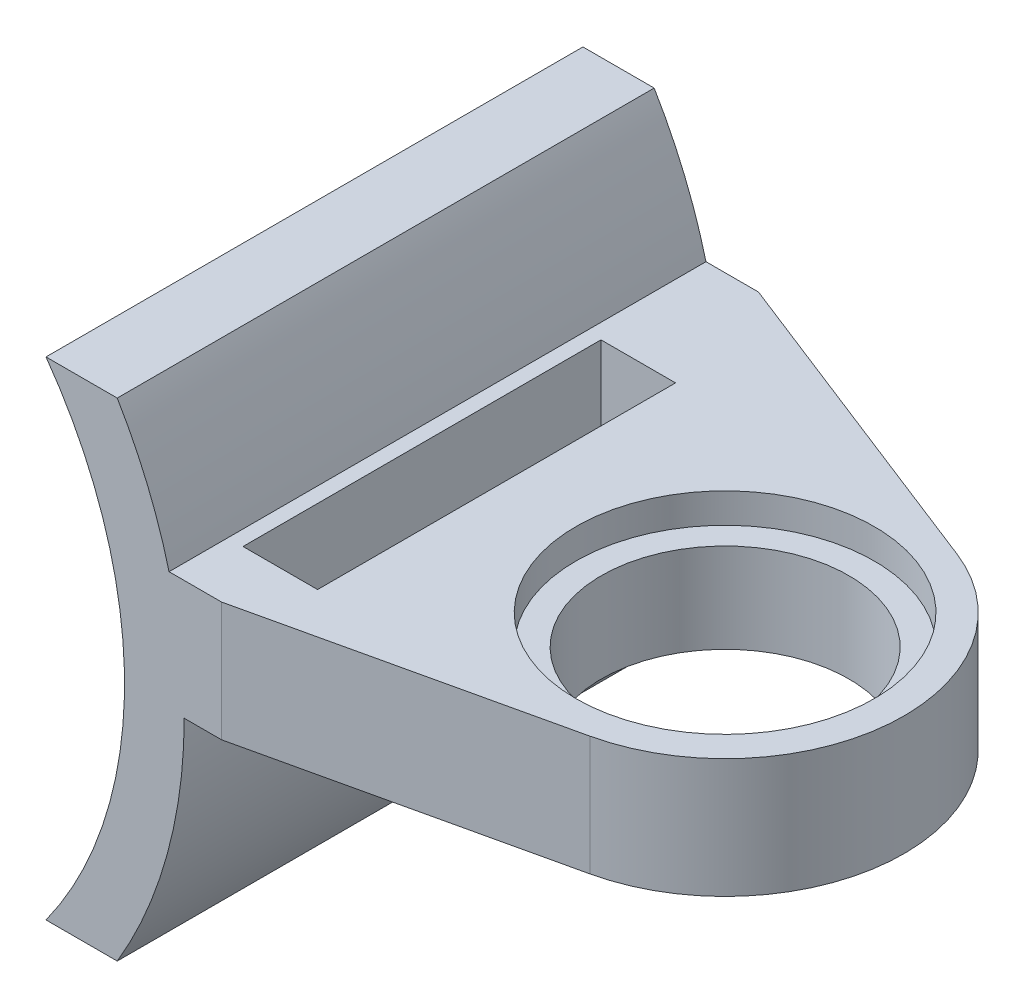
ISO-10303-21;
HEADER;
FILE_DESCRIPTION(('STEP AP214'),'2;1');
FILE_NAME('part.step','',(''),(''),'','','');
FILE_SCHEMA(('AUTOMOTIVE_DESIGN { 1 0 10303 214 1 1 1 1 }'));
ENDSEC;
DATA;
#1=APPLICATION_CONTEXT('core data for automotive mechanical design processes');
#2=APPLICATION_PROTOCOL_DEFINITION('international standard','automotive_design',2000,#1);
#3=PRODUCT_CONTEXT('',#1,'mechanical');
#4=PRODUCT('Part','Part','',(#3));
#5=PRODUCT_RELATED_PRODUCT_CATEGORY('part','',(#4));
#6=PRODUCT_DEFINITION_FORMATION('','',#4);
#7=PRODUCT_DEFINITION_CONTEXT('part definition',#1,'design');
#8=PRODUCT_DEFINITION('design','',#6,#7);
#9=PRODUCT_DEFINITION_SHAPE('','',#8);
#10=(LENGTH_UNIT() NAMED_UNIT(*) SI_UNIT(.MILLI.,.METRE.));
#11=(NAMED_UNIT(*) PLANE_ANGLE_UNIT() SI_UNIT($,.RADIAN.));
#12=(NAMED_UNIT(*) SI_UNIT($,.STERADIAN.) SOLID_ANGLE_UNIT());
#13=UNCERTAINTY_MEASURE_WITH_UNIT(LENGTH_MEASURE(1.E-05),#10,'distance_accuracy_value','');
#14=(GEOMETRIC_REPRESENTATION_CONTEXT(3) GLOBAL_UNCERTAINTY_ASSIGNED_CONTEXT((#13)) GLOBAL_UNIT_ASSIGNED_CONTEXT((#10,
#11,#12)) REPRESENTATION_CONTEXT('',''));
#15=CARTESIAN_POINT('',(0.,0.,0.));
#16=DIRECTION('',(0.,0.,1.));
#17=DIRECTION('',(1.,0.,0.));
#18=AXIS2_PLACEMENT_3D('',#15,#16,#17);
#19=CARTESIAN_POINT('',(26.,4.,9.86664222774607));
#20=DIRECTION('',(0.,-1.,0.));
#21=DIRECTION('',(0.,0.,-1.));
#22=AXIS2_PLACEMENT_3D('',#19,#20,#21);
#23=CYLINDRICAL_SURFACE('',#22,4.14999999999999);
#24=CARTESIAN_POINT('',(26.,0.,9.86664222774607));
#25=DIRECTION('',(0.,1.,0.));
#26=DIRECTION('',(0.,0.,1.));
#27=AXIS2_PLACEMENT_3D('',#24,#25,#26);
#28=CIRCLE('',#27,4.14999999999999);
#29=CARTESIAN_POINT('',(26.,0.,14.0166422277461));
#30=VERTEX_POINT('',#29);
#31=EDGE_CURVE('E171',#30,#30,#28,.T.);
#32=ORIENTED_EDGE('',*,*,#31,.F.);
#33=EDGE_LOOP('',(#32));
#34=FACE_BOUND('',#33,.T.);
#35=CARTESIAN_POINT('',(26.,3.,9.86664222774607));
#36=DIRECTION('',(0.,1.,0.));
#37=DIRECTION('',(0.,0.,1.));
#38=AXIS2_PLACEMENT_3D('',#35,#36,#37);
#39=CIRCLE('',#38,4.14999999999999);
#40=CARTESIAN_POINT('',(26.,3.,14.0166422277461));
#41=VERTEX_POINT('',#40);
#42=EDGE_CURVE('E39',#41,#41,#39,.T.);
#43=ORIENTED_EDGE('',*,*,#42,.T.);
#44=EDGE_LOOP('',(#43));
#45=FACE_BOUND('',#44,.T.);
#46=ADVANCED_FACE('F35',(#34,#45),#23,.F.);
#47=CARTESIAN_POINT('',(0.,0.,18.));
#48=DIRECTION('',(0.,0.,-1.));
#49=DIRECTION('',(-1.,0.,0.));
#50=AXIS2_PLACEMENT_3D('',#47,#48,#49);
#51=CYLINDRICAL_SURFACE('',#50,16.);
#52=DIRECTION('',(0.,0.,-1.));
#53=VECTOR('',#52,1.);
#54=CARTESIAN_POINT('',(15.4919333848297,4.,18.));
#55=LINE('',#54,#53);
#56=CARTESIAN_POINT('',(15.4919333848297,4.,0.));
#57=VERTEX_POINT('',#56);
#58=CARTESIAN_POINT('',(15.4919333848297,4.,18.));
#59=VERTEX_POINT('',#58);
#60=EDGE_CURVE('E220',#57,#59,#55,.F.);
#61=ORIENTED_EDGE('',*,*,#60,.F.);
#62=CARTESIAN_POINT('',(0.,0.,0.));
#63=DIRECTION('',(0.,0.,1.));
#64=DIRECTION('',(-1.,0.,0.));
#65=AXIS2_PLACEMENT_3D('',#62,#63,#64);
#66=CIRCLE('',#65,16.);
#67=CARTESIAN_POINT('',(13.7549507235002,8.1732080968297,0.));
#68=VERTEX_POINT('',#67);
#69=EDGE_CURVE('E239',#57,#68,#66,.T.);
#70=ORIENTED_EDGE('',*,*,#69,.T.);
#71=DIRECTION('',(0.,0.,-1.));
#72=VECTOR('',#71,1.);
#73=CARTESIAN_POINT('',(13.7549507235002,8.1732080968297,18.));
#74=LINE('',#73,#72);
#75=CARTESIAN_POINT('',(13.7549507235002,8.1732080968297,18.));
#76=VERTEX_POINT('',#75);
#77=EDGE_CURVE('E245',#76,#68,#74,.T.);
#78=ORIENTED_EDGE('',*,*,#77,.F.);
#79=CARTESIAN_POINT('',(0.,0.,18.));
#80=DIRECTION('',(0.,0.,1.));
#81=DIRECTION('',(-1.,0.,0.));
#82=AXIS2_PLACEMENT_3D('',#79,#80,#81);
#83=CIRCLE('',#82,16.);
#84=EDGE_CURVE('E59',#59,#76,#83,.T.);
#85=ORIENTED_EDGE('',*,*,#84,.F.);
#86=EDGE_LOOP('',(#61,#70,#78,#85));
#87=FACE_BOUND('',#86,.T.);
#88=ADVANCED_FACE('F285',(#87),#51,.T.);
#89=CARTESIAN_POINT('',(0.,0.,18.));
#90=DIRECTION('',(0.,0.,-1.));
#91=DIRECTION('',(-1.,0.,0.));
#92=AXIS2_PLACEMENT_3D('',#89,#90,#91);
#93=CYLINDRICAL_SURFACE('',#92,14.);
#94=CARTESIAN_POINT('',(0.,0.,0.));
#95=DIRECTION('',(0.,0.,-1.));
#96=DIRECTION('',(-1.,0.,0.));
#97=AXIS2_PLACEMENT_3D('',#94,#95,#96);
#98=CIRCLE('',#97,14.);
#99=CARTESIAN_POINT('',(11.3665592597724,8.17320809682969,0.));
#100=VERTEX_POINT('',#99);
#101=CARTESIAN_POINT('',(11.3665592597724,-8.17320809682969,0.));
#102=VERTEX_POINT('',#101);
#103=EDGE_CURVE('E222',#100,#102,#98,.T.);
#104=ORIENTED_EDGE('',*,*,#103,.T.);
#105=DIRECTION('',(0.,0.,-1.));
#106=VECTOR('',#105,1.);
#107=CARTESIAN_POINT('',(11.3665592597724,-8.17320809682969,18.));
#108=LINE('',#107,#106);
#109=CARTESIAN_POINT('',(11.3665592597724,-8.17320809682969,18.));
#110=VERTEX_POINT('',#109);
#111=EDGE_CURVE('E11',#110,#102,#108,.T.);
#112=ORIENTED_EDGE('',*,*,#111,.F.);
#113=CARTESIAN_POINT('',(0.,0.,18.));
#114=DIRECTION('',(0.,0.,-1.));
#115=DIRECTION('',(-1.,0.,0.));
#116=AXIS2_PLACEMENT_3D('',#113,#114,#115);
#117=CIRCLE('',#116,14.);
#118=CARTESIAN_POINT('',(11.3665592597724,8.17320809682969,18.));
#119=VERTEX_POINT('',#118);
#120=EDGE_CURVE('E223',#119,#110,#117,.T.);
#121=ORIENTED_EDGE('',*,*,#120,.F.);
#122=DIRECTION('',(0.,0.,-1.));
#123=VECTOR('',#122,1.);
#124=CARTESIAN_POINT('',(11.3665592597724,8.17320809682969,18.));
#125=LINE('',#124,#123);
#126=EDGE_CURVE('E234',#119,#100,#125,.T.);
#127=ORIENTED_EDGE('',*,*,#126,.T.);
#128=EDGE_LOOP('',(#104,#112,#121,#127));
#129=FACE_BOUND('',#128,.T.);
#130=ADVANCED_FACE('F37',(#129),#93,.F.);
#131=CARTESIAN_POINT('',(11.3665592597724,-8.17320809682969,18.));
#132=DIRECTION('',(0.,1.,0.));
#133=DIRECTION('',(-1.,0.,0.));
#134=AXIS2_PLACEMENT_3D('',#131,#132,#133);
#135=PLANE('',#134);
#136=DIRECTION('',(1.,0.,0.));
#137=VECTOR('',#136,1.);
#138=CARTESIAN_POINT('',(11.3665592597724,-8.17320809682969,0.));
#139=LINE('',#138,#137);
#140=CARTESIAN_POINT('',(13.7549507235002,-8.17320809682969,0.));
#141=VERTEX_POINT('',#140);
#142=EDGE_CURVE('E237',#102,#141,#139,.T.);
#143=ORIENTED_EDGE('',*,*,#142,.T.);
#144=DIRECTION('',(0.,0.,-1.));
#145=VECTOR('',#144,1.);
#146=CARTESIAN_POINT('',(13.7549507235002,-8.17320809682969,18.));
#147=LINE('',#146,#145);
#148=CARTESIAN_POINT('',(13.7549507235002,-8.17320809682969,18.));
#149=VERTEX_POINT('',#148);
#150=EDGE_CURVE('E44',#149,#141,#147,.T.);
#151=ORIENTED_EDGE('',*,*,#150,.F.);
#152=DIRECTION('',(1.,0.,0.));
#153=VECTOR('',#152,1.);
#154=CARTESIAN_POINT('',(11.3665592597724,-8.17320809682969,18.));
#155=LINE('',#154,#153);
#156=EDGE_CURVE('E226',#110,#149,#155,.T.);
#157=ORIENTED_EDGE('',*,*,#156,.F.);
#158=ORIENTED_EDGE('',*,*,#111,.T.);
#159=EDGE_LOOP('',(#143,#151,#157,#158));
#160=FACE_BOUND('',#159,.T.);
#161=ADVANCED_FACE('F278',(#160),#135,.F.);
#162=CARTESIAN_POINT('',(16.,0.,0.));
#163=VERTEX_POINT('',#162);
#164=EDGE_CURVE('E240',#141,#163,#66,.T.);
#165=ORIENTED_EDGE('',*,*,#164,.T.);
#166=DIRECTION('',(0.,0.,-1.));
#167=VECTOR('',#166,1.);
#168=CARTESIAN_POINT('',(16.,0.,18.));
#169=LINE('',#168,#167);
#170=CARTESIAN_POINT('',(16.,0.,4.02857880392938));
#171=VERTEX_POINT('',#170);
#172=EDGE_CURVE('E219',#163,#171,#169,.F.);
#173=ORIENTED_EDGE('',*,*,#172,.T.);
#174=DIRECTION('',(0.,0.,1.));
#175=VECTOR('',#174,1.);
#176=CARTESIAN_POINT('',(16.,0.,16.0285788039294));
#177=LINE('',#176,#175);
#178=CARTESIAN_POINT('',(16.,0.,16.0285788039294));
#179=VERTEX_POINT('',#178);
#180=EDGE_CURVE('E51',#171,#179,#177,.T.);
#181=ORIENTED_EDGE('',*,*,#180,.T.);
#182=CARTESIAN_POINT('',(16.,0.,18.));
#183=VERTEX_POINT('',#182);
#184=EDGE_CURVE('E217',#179,#183,#169,.F.);
#185=ORIENTED_EDGE('',*,*,#184,.T.);
#186=EDGE_CURVE('E229',#149,#183,#83,.T.);
#187=ORIENTED_EDGE('',*,*,#186,.F.);
#188=ORIENTED_EDGE('',*,*,#150,.T.);
#189=EDGE_LOOP('',(#165,#173,#181,#185,#187,#188));
#190=FACE_BOUND('',#189,.T.);
#191=ADVANCED_FACE('F252',(#190),#51,.T.);
#192=CARTESIAN_POINT('',(13.7549507235002,8.1732080968297,18.));
#193=DIRECTION('',(0.,-1.,0.));
#194=DIRECTION('',(1.,0.,0.));
#195=AXIS2_PLACEMENT_3D('',#192,#193,#194);
#196=PLANE('',#195);
#197=DIRECTION('',(-1.,0.,0.));
#198=VECTOR('',#197,1.);
#199=CARTESIAN_POINT('',(13.7549507235002,8.1732080968297,0.));
#200=LINE('',#199,#198);
#201=EDGE_CURVE('E227',#68,#100,#200,.T.);
#202=ORIENTED_EDGE('',*,*,#201,.T.);
#203=ORIENTED_EDGE('',*,*,#126,.F.);
#204=DIRECTION('',(-1.,0.,0.));
#205=VECTOR('',#204,1.);
#206=CARTESIAN_POINT('',(13.7549507235002,8.1732080968297,18.));
#207=LINE('',#206,#205);
#208=EDGE_CURVE('E232',#76,#119,#207,.T.);
#209=ORIENTED_EDGE('',*,*,#208,.F.);
#210=ORIENTED_EDGE('',*,*,#77,.T.);
#211=EDGE_LOOP('',(#202,#203,#209,#210));
#212=FACE_BOUND('',#211,.T.);
#213=ADVANCED_FACE('F283',(#212),#196,.F.);
#214=CARTESIAN_POINT('',(0.,0.,18.));
#215=DIRECTION('',(0.,0.,-1.));
#216=DIRECTION('',(-1.,0.,0.));
#217=AXIS2_PLACEMENT_3D('',#214,#215,#216);
#218=PLANE('',#217);
#219=ORIENTED_EDGE('',*,*,#186,.T.);
#220=DIRECTION('',(1.,0.,0.));
#221=VECTOR('',#220,1.);
#222=CARTESIAN_POINT('',(17.25,0.,18.));
#223=LINE('',#222,#221);
#224=CARTESIAN_POINT('',(17.25,0.,18.));
#225=VERTEX_POINT('',#224);
#226=EDGE_CURVE('E203',#183,#225,#223,.T.);
#227=ORIENTED_EDGE('',*,*,#226,.T.);
#228=DIRECTION('',(0.,-1.,0.));
#229=VECTOR('',#228,1.);
#230=CARTESIAN_POINT('',(17.25,4.,18.));
#231=LINE('',#230,#229);
#232=CARTESIAN_POINT('',(17.25,4.,18.));
#233=VERTEX_POINT('',#232);
#234=EDGE_CURVE('E208',#233,#225,#231,.T.);
#235=ORIENTED_EDGE('',*,*,#234,.F.);
#236=DIRECTION('',(1.,0.,0.));
#237=VECTOR('',#236,1.);
#238=CARTESIAN_POINT('',(17.25,4.,18.));
#239=LINE('',#238,#237);
#240=EDGE_CURVE('E191',#59,#233,#239,.T.);
#241=ORIENTED_EDGE('',*,*,#240,.F.);
#242=ORIENTED_EDGE('',*,*,#84,.T.);
#243=ORIENTED_EDGE('',*,*,#208,.T.);
#244=ORIENTED_EDGE('',*,*,#120,.T.);
#245=ORIENTED_EDGE('',*,*,#156,.T.);
#246=EDGE_LOOP('',(#219,#227,#235,#241,#242,#243,#244,#245));
#247=FACE_BOUND('',#246,.T.);
#248=ADVANCED_FACE('F274',(#247),#218,.F.);
#249=CARTESIAN_POINT('',(0.,0.,0.));
#250=DIRECTION('',(0.,0.,-1.));
#251=DIRECTION('',(-1.,0.,0.));
#252=AXIS2_PLACEMENT_3D('',#249,#250,#251);
#253=PLANE('',#252);
#254=ORIENTED_EDGE('',*,*,#69,.F.);
#255=DIRECTION('',(-1.,0.,0.));
#256=VECTOR('',#255,1.);
#257=CARTESIAN_POINT('',(14.8774753617501,4.,0.));
#258=LINE('',#257,#256);
#259=CARTESIAN_POINT('',(17.25,4.,0.));
#260=VERTEX_POINT('',#259);
#261=EDGE_CURVE('E188',#260,#57,#258,.T.);
#262=ORIENTED_EDGE('',*,*,#261,.F.);
#263=DIRECTION('',(0.,-1.,0.));
#264=VECTOR('',#263,1.);
#265=CARTESIAN_POINT('',(17.25,4.,0.));
#266=LINE('',#265,#264);
#267=CARTESIAN_POINT('',(17.25,0.,0.));
#268=VERTEX_POINT('',#267);
#269=EDGE_CURVE('E211',#260,#268,#266,.T.);
#270=ORIENTED_EDGE('',*,*,#269,.T.);
#271=DIRECTION('',(-1.,0.,0.));
#272=VECTOR('',#271,1.);
#273=CARTESIAN_POINT('',(14.8774753617501,0.,0.));
#274=LINE('',#273,#272);
#275=EDGE_CURVE('E200',#268,#163,#274,.T.);
#276=ORIENTED_EDGE('',*,*,#275,.T.);
#277=ORIENTED_EDGE('',*,*,#164,.F.);
#278=ORIENTED_EDGE('',*,*,#142,.F.);
#279=ORIENTED_EDGE('',*,*,#103,.F.);
#280=ORIENTED_EDGE('',*,*,#201,.F.);
#281=EDGE_LOOP('',(#254,#262,#270,#276,#277,#278,#279,#280));
#282=FACE_BOUND('',#281,.T.);
#283=ADVANCED_FACE('F257',(#282),#253,.T.);
#284=CARTESIAN_POINT('',(26.,4.,9.86664222774607));
#285=DIRECTION('',(0.,-1.,0.));
#286=DIRECTION('',(0.,0.,-1.));
#287=AXIS2_PLACEMENT_3D('',#284,#285,#286);
#288=PLANE('',#287);
#289=CARTESIAN_POINT('',(26.,4.,9.86664222774607));
#290=DIRECTION('',(0.,1.,0.));
#291=DIRECTION('',(0.,0.,1.));
#292=AXIS2_PLACEMENT_3D('',#289,#290,#291);
#293=CIRCLE('',#292,5.);
#294=CARTESIAN_POINT('',(26.,4.,14.8666422277461));
#295=VERTEX_POINT('',#294);
#296=EDGE_CURVE('E337',#295,#295,#293,.T.);
#297=ORIENTED_EDGE('',*,*,#296,.F.);
#298=EDGE_LOOP('',(#297));
#299=FACE_BOUND('',#298,.T.);
#300=DIRECTION('',(0.,0.,1.));
#301=VECTOR('',#300,1.);
#302=CARTESIAN_POINT('',(16.,4.,16.0285788039294));
#303=LINE('',#302,#301);
#304=CARTESIAN_POINT('',(16.,4.,4.02857880392938));
#305=VERTEX_POINT('',#304);
#306=CARTESIAN_POINT('',(16.,4.,16.0285788039294));
#307=VERTEX_POINT('',#306);
#308=EDGE_CURVE('E138',#305,#307,#303,.T.);
#309=ORIENTED_EDGE('',*,*,#308,.F.);
#310=DIRECTION('',(-1.,0.,0.));
#311=VECTOR('',#310,1.);
#312=CARTESIAN_POINT('',(16.,4.,4.02857880392938));
#313=LINE('',#312,#311);
#314=CARTESIAN_POINT('',(18.5,4.,4.02857880392938));
#315=VERTEX_POINT('',#314);
#316=EDGE_CURVE('E165',#315,#305,#313,.T.);
#317=ORIENTED_EDGE('',*,*,#316,.F.);
#318=DIRECTION('',(0.,0.,-1.));
#319=VECTOR('',#318,1.);
#320=CARTESIAN_POINT('',(18.5,4.,16.0285788039294));
#321=LINE('',#320,#319);
#322=CARTESIAN_POINT('',(18.5,4.,16.0285788039294));
#323=VERTEX_POINT('',#322);
#324=EDGE_CURVE('E163',#323,#315,#321,.T.);
#325=ORIENTED_EDGE('',*,*,#324,.F.);
#326=DIRECTION('',(1.,0.,0.));
#327=VECTOR('',#326,1.);
#328=CARTESIAN_POINT('',(16.,4.,16.0285788039294));
#329=LINE('',#328,#327);
#330=EDGE_CURVE('E147',#307,#323,#329,.T.);
#331=ORIENTED_EDGE('',*,*,#330,.F.);
#332=EDGE_LOOP('',(#309,#317,#325,#331));
#333=FACE_BOUND('',#332,.T.);
#334=ORIENTED_EDGE('',*,*,#261,.T.);
#335=ORIENTED_EDGE('',*,*,#60,.T.);
#336=ORIENTED_EDGE('',*,*,#240,.T.);
#337=DIRECTION('',(0.975305869114821,0.,-0.220858465244561));
#338=VECTOR('',#337,1.);
#339=CARTESIAN_POINT('',(17.25,4.,18.));
#340=LINE('',#339,#338);
#341=CARTESIAN_POINT('',(27.3251507914674,4.,15.718477442435));
#342=VERTEX_POINT('',#341);
#343=EDGE_CURVE('E193',#233,#342,#340,.T.);
#344=ORIENTED_EDGE('',*,*,#343,.T.);
#345=CARTESIAN_POINT('',(26.,4.,9.86664222774607));
#346=DIRECTION('',(0.,1.,0.));
#347=DIRECTION('',(0.,0.,-1.));
#348=AXIS2_PLACEMENT_3D('',#345,#346,#347);
#349=CIRCLE('',#348,6.);
#350=CARTESIAN_POINT('',(28.1862747826835,4.,4.27913808236932));
#351=VERTEX_POINT('',#350);
#352=EDGE_CURVE('E182',#342,#351,#349,.T.);
#353=ORIENTED_EDGE('',*,*,#352,.T.);
#354=DIRECTION('',(-0.931250690896124,0.,-0.364379130447246));
#355=VECTOR('',#354,1.);
#356=CARTESIAN_POINT('',(28.1862747826835,4.,4.27913808236932));
#357=LINE('',#356,#355);
#358=EDGE_CURVE('E185',#351,#260,#357,.T.);
#359=ORIENTED_EDGE('',*,*,#358,.T.);
#360=EDGE_LOOP('',(#334,#335,#336,#344,#353,#359));
#361=FACE_BOUND('',#360,.T.);
#362=ADVANCED_FACE('F160',(#299,#333,#361),#288,.F.);
#363=CARTESIAN_POINT('',(26.,0.,9.86664222774607));
#364=DIRECTION('',(0.,-1.,0.));
#365=DIRECTION('',(0.,0.,-1.));
#366=AXIS2_PLACEMENT_3D('',#363,#364,#365);
#367=PLANE('',#366);
#368=ORIENTED_EDGE('',*,*,#31,.T.);
#369=EDGE_LOOP('',(#368));
#370=FACE_BOUND('',#369,.T.);
#371=ORIENTED_EDGE('',*,*,#172,.F.);
#372=ORIENTED_EDGE('',*,*,#275,.F.);
#373=DIRECTION('',(-0.931250690896124,0.,-0.364379130447246));
#374=VECTOR('',#373,1.);
#375=CARTESIAN_POINT('',(28.1862747826835,0.,4.27913808236932));
#376=LINE('',#375,#374);
#377=CARTESIAN_POINT('',(28.1862747826835,0.,4.27913808236932));
#378=VERTEX_POINT('',#377);
#379=EDGE_CURVE('E198',#378,#268,#376,.T.);
#380=ORIENTED_EDGE('',*,*,#379,.F.);
#381=CARTESIAN_POINT('',(26.,0.,9.86664222774607));
#382=DIRECTION('',(0.,1.,0.));
#383=DIRECTION('',(0.,0.,-1.));
#384=AXIS2_PLACEMENT_3D('',#381,#382,#383);
#385=CIRCLE('',#384,6.);
#386=CARTESIAN_POINT('',(27.3251507914674,0.,15.718477442435));
#387=VERTEX_POINT('',#386);
#388=EDGE_CURVE('E156',#387,#378,#385,.T.);
#389=ORIENTED_EDGE('',*,*,#388,.F.);
#390=DIRECTION('',(0.975305869114821,0.,-0.220858465244561));
#391=VECTOR('',#390,1.);
#392=CARTESIAN_POINT('',(17.25,0.,18.));
#393=LINE('',#392,#391);
#394=EDGE_CURVE('E186',#225,#387,#393,.T.);
#395=ORIENTED_EDGE('',*,*,#394,.F.);
#396=ORIENTED_EDGE('',*,*,#226,.F.);
#397=ORIENTED_EDGE('',*,*,#184,.F.);
#398=DIRECTION('',(1.,0.,0.));
#399=VECTOR('',#398,1.);
#400=CARTESIAN_POINT('',(16.,0.,16.0285788039294));
#401=LINE('',#400,#399);
#402=CARTESIAN_POINT('',(18.5,0.,16.0285788039294));
#403=VERTEX_POINT('',#402);
#404=EDGE_CURVE('E155',#179,#403,#401,.T.);
#405=ORIENTED_EDGE('',*,*,#404,.T.);
#406=DIRECTION('',(0.,0.,-1.));
#407=VECTOR('',#406,1.);
#408=CARTESIAN_POINT('',(18.5,0.,16.0285788039294));
#409=LINE('',#408,#407);
#410=CARTESIAN_POINT('',(18.5,0.,4.02857880392938));
#411=VERTEX_POINT('',#410);
#412=EDGE_CURVE('E173',#403,#411,#409,.T.);
#413=ORIENTED_EDGE('',*,*,#412,.T.);
#414=DIRECTION('',(-1.,0.,0.));
#415=VECTOR('',#414,1.);
#416=CARTESIAN_POINT('',(16.,0.,4.02857880392938));
#417=LINE('',#416,#415);
#418=EDGE_CURVE('E148',#411,#171,#417,.T.);
#419=ORIENTED_EDGE('',*,*,#418,.T.);
#420=EDGE_LOOP('',(#371,#372,#380,#389,#395,#396,#397,#405,#413,#419));
#421=FACE_BOUND('',#420,.T.);
#422=ADVANCED_FACE('F263',(#370,#421),#367,.T.);
#423=CARTESIAN_POINT('',(26.,4.,9.86664222774607));
#424=DIRECTION('',(0.,-1.,0.));
#425=DIRECTION('',(0.,0.,-1.));
#426=AXIS2_PLACEMENT_3D('',#423,#424,#425);
#427=CYLINDRICAL_SURFACE('',#426,6.);
#428=ORIENTED_EDGE('',*,*,#388,.T.);
#429=DIRECTION('',(0.,-1.,0.));
#430=VECTOR('',#429,1.);
#431=CARTESIAN_POINT('',(28.1862747826835,4.,4.27913808236932));
#432=LINE('',#431,#430);
#433=EDGE_CURVE('E214',#351,#378,#432,.T.);
#434=ORIENTED_EDGE('',*,*,#433,.F.);
#435=ORIENTED_EDGE('',*,*,#352,.F.);
#436=DIRECTION('',(0.,-1.,0.));
#437=VECTOR('',#436,1.);
#438=CARTESIAN_POINT('',(27.3251507914674,4.,15.718477442435));
#439=LINE('',#438,#437);
#440=EDGE_CURVE('E195',#342,#387,#439,.T.);
#441=ORIENTED_EDGE('',*,*,#440,.T.);
#442=EDGE_LOOP('',(#428,#434,#435,#441));
#443=FACE_BOUND('',#442,.T.);
#444=ADVANCED_FACE('F294',(#443),#427,.T.);
#445=CARTESIAN_POINT('',(28.1862747826835,4.,4.27913808236932));
#446=DIRECTION('',(-0.364379130447246,0.,0.931250690896124));
#447=DIRECTION('',(0.931250690896124,0.,0.364379130447246));
#448=AXIS2_PLACEMENT_3D('',#445,#446,#447);
#449=PLANE('',#448);
#450=ORIENTED_EDGE('',*,*,#379,.T.);
#451=ORIENTED_EDGE('',*,*,#269,.F.);
#452=ORIENTED_EDGE('',*,*,#358,.F.);
#453=ORIENTED_EDGE('',*,*,#433,.T.);
#454=EDGE_LOOP('',(#450,#451,#452,#453));
#455=FACE_BOUND('',#454,.T.);
#456=ADVANCED_FACE('F296',(#455),#449,.F.);
#457=CARTESIAN_POINT('',(17.25,4.,18.));
#458=DIRECTION('',(-0.220858465244561,0.,-0.975305869114821));
#459=DIRECTION('',(-0.975305869114821,0.,0.220858465244561));
#460=AXIS2_PLACEMENT_3D('',#457,#458,#459);
#461=PLANE('',#460);
#462=ORIENTED_EDGE('',*,*,#394,.T.);
#463=ORIENTED_EDGE('',*,*,#440,.F.);
#464=ORIENTED_EDGE('',*,*,#343,.F.);
#465=ORIENTED_EDGE('',*,*,#234,.T.);
#466=EDGE_LOOP('',(#462,#463,#464,#465));
#467=FACE_BOUND('',#466,.T.);
#468=ADVANCED_FACE('F290',(#467),#461,.F.);
#469=CARTESIAN_POINT('',(16.,4.,16.0285788039294));
#470=DIRECTION('',(1.,0.,0.));
#471=DIRECTION('',(0.,0.,-1.));
#472=AXIS2_PLACEMENT_3D('',#469,#470,#471);
#473=PLANE('',#472);
#474=ORIENTED_EDGE('',*,*,#180,.F.);
#475=DIRECTION('',(0.,-1.,0.));
#476=VECTOR('',#475,1.);
#477=CARTESIAN_POINT('',(16.,4.,4.02857880392938));
#478=LINE('',#477,#476);
#479=EDGE_CURVE('E143',#305,#171,#478,.T.);
#480=ORIENTED_EDGE('',*,*,#479,.F.);
#481=ORIENTED_EDGE('',*,*,#308,.T.);
#482=DIRECTION('',(0.,-1.,0.));
#483=VECTOR('',#482,1.);
#484=CARTESIAN_POINT('',(16.,4.,16.0285788039294));
#485=LINE('',#484,#483);
#486=EDGE_CURVE('E141',#307,#179,#485,.T.);
#487=ORIENTED_EDGE('',*,*,#486,.T.);
#488=EDGE_LOOP('',(#474,#480,#481,#487));
#489=FACE_BOUND('',#488,.T.);
#490=ADVANCED_FACE('F140',(#489),#473,.T.);
#491=CARTESIAN_POINT('',(16.,4.,16.0285788039294));
#492=DIRECTION('',(0.,0.,-1.));
#493=DIRECTION('',(-1.,0.,0.));
#494=AXIS2_PLACEMENT_3D('',#491,#492,#493);
#495=PLANE('',#494);
#496=ORIENTED_EDGE('',*,*,#404,.F.);
#497=ORIENTED_EDGE('',*,*,#486,.F.);
#498=ORIENTED_EDGE('',*,*,#330,.T.);
#499=DIRECTION('',(0.,-1.,0.));
#500=VECTOR('',#499,1.);
#501=CARTESIAN_POINT('',(18.5,4.,16.0285788039294));
#502=LINE('',#501,#500);
#503=EDGE_CURVE('E157',#323,#403,#502,.T.);
#504=ORIENTED_EDGE('',*,*,#503,.T.);
#505=EDGE_LOOP('',(#496,#497,#498,#504));
#506=FACE_BOUND('',#505,.T.);
#507=ADVANCED_FACE('F152',(#506),#495,.T.);
#508=CARTESIAN_POINT('',(18.5,4.,16.0285788039294));
#509=DIRECTION('',(-1.,0.,0.));
#510=DIRECTION('',(0.,0.,1.));
#511=AXIS2_PLACEMENT_3D('',#508,#509,#510);
#512=PLANE('',#511);
#513=ORIENTED_EDGE('',*,*,#412,.F.);
#514=ORIENTED_EDGE('',*,*,#503,.F.);
#515=ORIENTED_EDGE('',*,*,#324,.T.);
#516=DIRECTION('',(0.,-1.,0.));
#517=VECTOR('',#516,1.);
#518=CARTESIAN_POINT('',(18.5,4.,4.02857880392938));
#519=LINE('',#518,#517);
#520=EDGE_CURVE('E179',#315,#411,#519,.T.);
#521=ORIENTED_EDGE('',*,*,#520,.T.);
#522=EDGE_LOOP('',(#513,#514,#515,#521));
#523=FACE_BOUND('',#522,.T.);
#524=ADVANCED_FACE('F270',(#523),#512,.T.);
#525=CARTESIAN_POINT('',(16.,4.,4.02857880392938));
#526=DIRECTION('',(0.,0.,1.));
#527=DIRECTION('',(1.,0.,0.));
#528=AXIS2_PLACEMENT_3D('',#525,#526,#527);
#529=PLANE('',#528);
#530=ORIENTED_EDGE('',*,*,#418,.F.);
#531=ORIENTED_EDGE('',*,*,#520,.F.);
#532=ORIENTED_EDGE('',*,*,#316,.T.);
#533=ORIENTED_EDGE('',*,*,#479,.T.);
#534=EDGE_LOOP('',(#530,#531,#532,#533));
#535=FACE_BOUND('',#534,.T.);
#536=ADVANCED_FACE('F267',(#535),#529,.T.);
#537=CARTESIAN_POINT('',(26.,3.,9.86664222774607));
#538=DIRECTION('',(0.,1.,0.));
#539=DIRECTION('',(0.,0.,1.));
#540=AXIS2_PLACEMENT_3D('',#537,#538,#539);
#541=CYLINDRICAL_SURFACE('',#540,5.);
#542=CARTESIAN_POINT('',(26.,3.,9.86664222774607));
#543=DIRECTION('',(0.,1.,0.));
#544=DIRECTION('',(0.,0.,1.));
#545=AXIS2_PLACEMENT_3D('',#542,#543,#544);
#546=CIRCLE('',#545,5.);
#547=CARTESIAN_POINT('',(26.,3.,14.8666422277461));
#548=VERTEX_POINT('',#547);
#549=EDGE_CURVE('E335',#548,#548,#546,.T.);
#550=ORIENTED_EDGE('',*,*,#549,.F.);
#551=EDGE_LOOP('',(#550));
#552=FACE_BOUND('',#551,.T.);
#553=ORIENTED_EDGE('',*,*,#296,.T.);
#554=EDGE_LOOP('',(#553));
#555=FACE_BOUND('',#554,.T.);
#556=ADVANCED_FACE('F316',(#552,#555),#541,.F.);
#557=CARTESIAN_POINT('',(26.,3.,9.86664222774607));
#558=DIRECTION('',(0.,1.,0.));
#559=DIRECTION('',(0.,0.,1.));
#560=AXIS2_PLACEMENT_3D('',#557,#558,#559);
#561=PLANE('',#560);
#562=ORIENTED_EDGE('',*,*,#42,.F.);
#563=EDGE_LOOP('',(#562));
#564=FACE_BOUND('',#563,.T.);
#565=ORIENTED_EDGE('',*,*,#549,.T.);
#566=EDGE_LOOP('',(#565));
#567=FACE_BOUND('',#566,.T.);
#568=ADVANCED_FACE('F343',(#564,#567),#561,.T.);
#569=CLOSED_SHELL('',(#46,#88,#130,#161,#191,#213,#248,#283,#362,#422,#444,#456,#468,#490,#507,
#524,#536,#556,#568));
#570=MANIFOLD_SOLID_BREP('B2',#569);
#571=ADVANCED_BREP_SHAPE_REPRESENTATION('',(#18,#570),#14);
#572=SHAPE_DEFINITION_REPRESENTATION(#9,#571);
ENDSEC;
END-ISO-10303-21;
